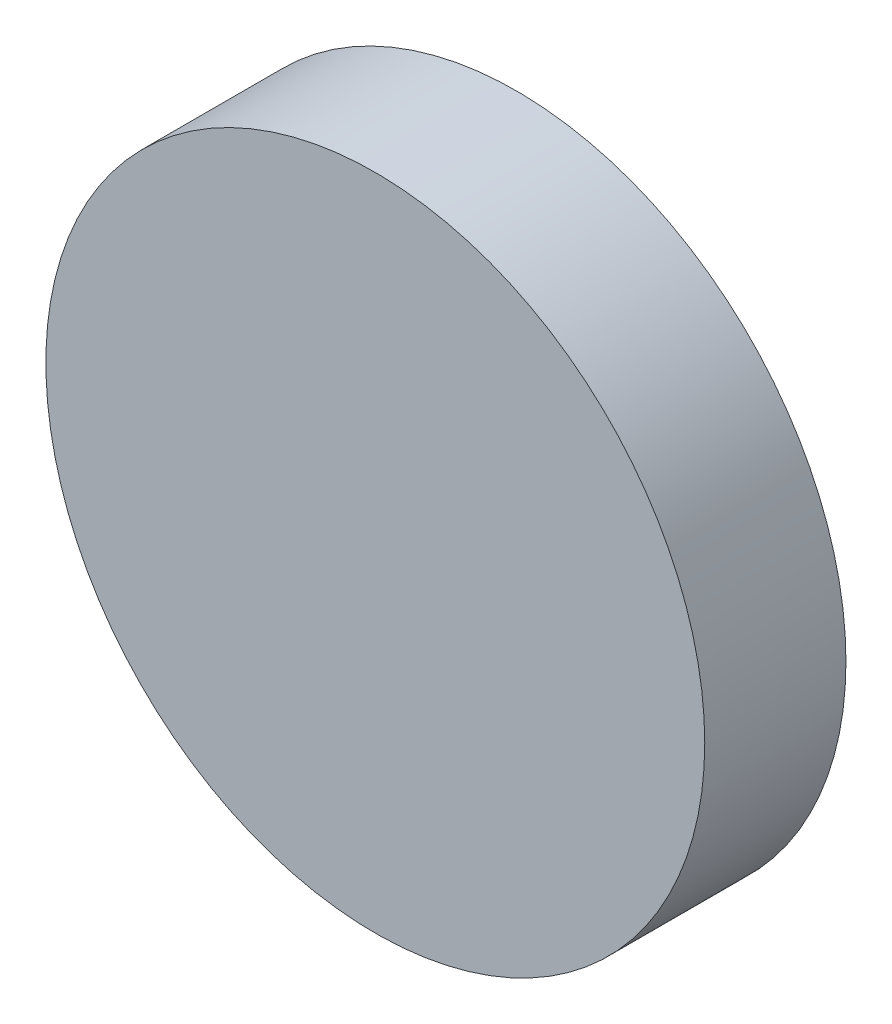
ISO-10303-21;
HEADER;
FILE_DESCRIPTION(('STEP AP214'),'2;1');
FILE_NAME('part.step','',(''),(''),'','','');
FILE_SCHEMA(('AUTOMOTIVE_DESIGN { 1 0 10303 214 1 1 1 1 }'));
ENDSEC;
DATA;
#1=APPLICATION_CONTEXT('core data for automotive mechanical design processes');
#2=APPLICATION_PROTOCOL_DEFINITION('international standard','automotive_design',2000,#1);
#3=PRODUCT_CONTEXT('',#1,'mechanical');
#4=PRODUCT('Part','Part','',(#3));
#5=PRODUCT_RELATED_PRODUCT_CATEGORY('part','',(#4));
#6=PRODUCT_DEFINITION_FORMATION('','',#4);
#7=PRODUCT_DEFINITION_CONTEXT('part definition',#1,'design');
#8=PRODUCT_DEFINITION('design','',#6,#7);
#9=PRODUCT_DEFINITION_SHAPE('','',#8);
#10=(LENGTH_UNIT() NAMED_UNIT(*) SI_UNIT(.MILLI.,.METRE.));
#11=(NAMED_UNIT(*) PLANE_ANGLE_UNIT() SI_UNIT($,.RADIAN.));
#12=(NAMED_UNIT(*) SI_UNIT($,.STERADIAN.) SOLID_ANGLE_UNIT());
#13=UNCERTAINTY_MEASURE_WITH_UNIT(LENGTH_MEASURE(1.E-05),#10,'distance_accuracy_value','');
#14=(GEOMETRIC_REPRESENTATION_CONTEXT(3) GLOBAL_UNCERTAINTY_ASSIGNED_CONTEXT((#13)) GLOBAL_UNIT_ASSIGNED_CONTEXT((#10,
#11,#12)) REPRESENTATION_CONTEXT('',''));
#15=CARTESIAN_POINT('',(0.,0.,0.));
#16=DIRECTION('',(0.,0.,1.));
#17=DIRECTION('',(1.,0.,0.));
#18=AXIS2_PLACEMENT_3D('',#15,#16,#17);
#19=CARTESIAN_POINT('',(0.,0.,1.5));
#20=DIRECTION('',(0.,0.,-1.));
#21=DIRECTION('',(-1.,0.,0.));
#22=AXIS2_PLACEMENT_3D('',#19,#20,#21);
#23=CYLINDRICAL_SURFACE('',#22,3.5);
#24=CARTESIAN_POINT('',(0.,0.,1.5));
#25=DIRECTION('',(0.,0.,1.));
#26=DIRECTION('',(1.,0.,0.));
#27=AXIS2_PLACEMENT_3D('',#24,#25,#26);
#28=CIRCLE('',#27,3.5);
#29=CARTESIAN_POINT('',(3.5,0.,1.5));
#30=VERTEX_POINT('',#29);
#31=EDGE_CURVE('E10',#30,#30,#28,.T.);
#32=ORIENTED_EDGE('',*,*,#31,.F.);
#33=EDGE_LOOP('',(#32));
#34=FACE_BOUND('',#33,.T.);
#35=CARTESIAN_POINT('',(0.,0.,0.));
#36=DIRECTION('',(0.,0.,1.));
#37=DIRECTION('',(1.,0.,0.));
#38=AXIS2_PLACEMENT_3D('',#35,#36,#37);
#39=CIRCLE('',#38,3.5);
#40=CARTESIAN_POINT('',(3.5,0.,0.));
#41=VERTEX_POINT('',#40);
#42=EDGE_CURVE('E40',#41,#41,#39,.T.);
#43=ORIENTED_EDGE('',*,*,#42,.T.);
#44=EDGE_LOOP('',(#43));
#45=FACE_BOUND('',#44,.T.);
#46=ADVANCED_FACE('F37',(#34,#45),#23,.T.);
#47=CARTESIAN_POINT('',(0.,0.,1.5));
#48=DIRECTION('',(0.,0.,1.));
#49=DIRECTION('',(1.,0.,0.));
#50=AXIS2_PLACEMENT_3D('',#47,#48,#49);
#51=PLANE('',#50);
#52=ORIENTED_EDGE('',*,*,#31,.T.);
#53=EDGE_LOOP('',(#52));
#54=FACE_BOUND('',#53,.T.);
#55=ADVANCED_FACE('F54',(#54),#51,.T.);
#56=CARTESIAN_POINT('',(0.,0.,0.));
#57=DIRECTION('',(0.,0.,1.));
#58=DIRECTION('',(1.,0.,0.));
#59=AXIS2_PLACEMENT_3D('',#56,#57,#58);
#60=PLANE('',#59);
#61=ORIENTED_EDGE('',*,*,#42,.F.);
#62=EDGE_LOOP('',(#61));
#63=FACE_BOUND('',#62,.T.);
#64=ADVANCED_FACE('F52',(#63),#60,.F.);
#65=CLOSED_SHELL('',(#46,#55,#64));
#66=MANIFOLD_SOLID_BREP('B2',#65);
#67=ADVANCED_BREP_SHAPE_REPRESENTATION('',(#18,#66),#14);
#68=SHAPE_DEFINITION_REPRESENTATION(#9,#67);
ENDSEC;
END-ISO-10303-21;
